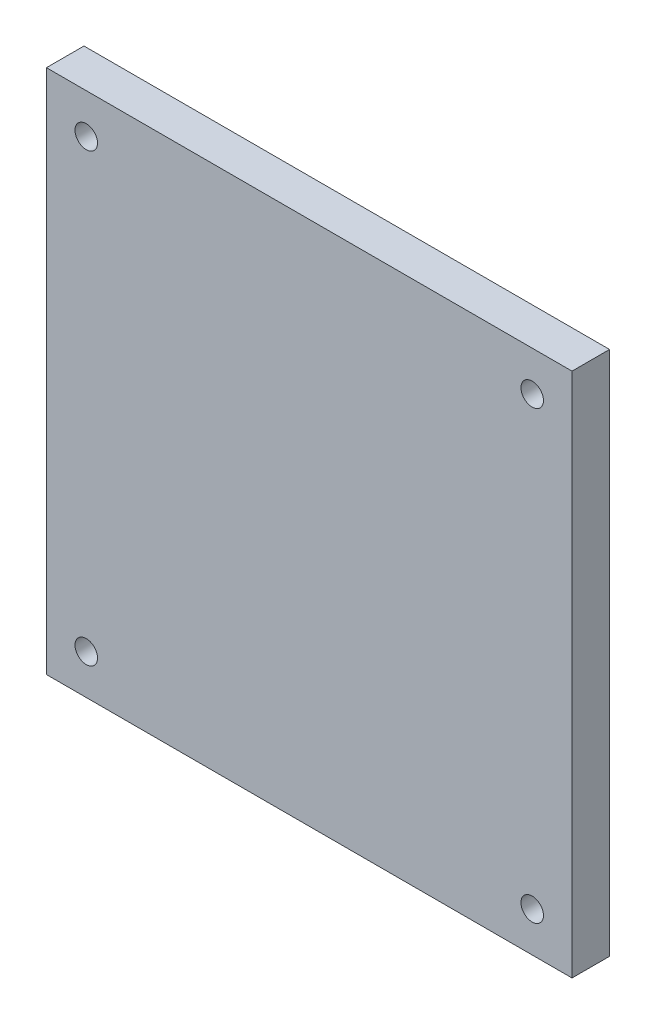
ISO-10303-21;
HEADER;
FILE_DESCRIPTION(('STEP AP214'),'2;1');
FILE_NAME('part.step','',(''),(''),'','','');
FILE_SCHEMA(('AUTOMOTIVE_DESIGN { 1 0 10303 214 1 1 1 1 }'));
ENDSEC;
DATA;
#1=APPLICATION_CONTEXT('core data for automotive mechanical design processes');
#2=APPLICATION_PROTOCOL_DEFINITION('international standard','automotive_design',2000,#1);
#3=PRODUCT_CONTEXT('',#1,'mechanical');
#4=PRODUCT('Part','Part','',(#3));
#5=PRODUCT_RELATED_PRODUCT_CATEGORY('part','',(#4));
#6=PRODUCT_DEFINITION_FORMATION('','',#4);
#7=PRODUCT_DEFINITION_CONTEXT('part definition',#1,'design');
#8=PRODUCT_DEFINITION('design','',#6,#7);
#9=PRODUCT_DEFINITION_SHAPE('','',#8);
#10=(LENGTH_UNIT() NAMED_UNIT(*) SI_UNIT(.MILLI.,.METRE.));
#11=(NAMED_UNIT(*) PLANE_ANGLE_UNIT() SI_UNIT($,.RADIAN.));
#12=(NAMED_UNIT(*) SI_UNIT($,.STERADIAN.) SOLID_ANGLE_UNIT());
#13=UNCERTAINTY_MEASURE_WITH_UNIT(LENGTH_MEASURE(1.E-05),#10,'distance_accuracy_value','');
#14=(GEOMETRIC_REPRESENTATION_CONTEXT(3) GLOBAL_UNCERTAINTY_ASSIGNED_CONTEXT((#13)) GLOBAL_UNIT_ASSIGNED_CONTEXT((#10,
#11,#12)) REPRESENTATION_CONTEXT('',''));
#15=CARTESIAN_POINT('',(0.,0.,0.));
#16=DIRECTION('',(0.,0.,1.));
#17=DIRECTION('',(1.,0.,0.));
#18=AXIS2_PLACEMENT_3D('',#15,#16,#17);
#19=CARTESIAN_POINT('',(-35.,-35.,5.));
#20=DIRECTION('',(1.,0.,0.));
#21=DIRECTION('',(0.,0.,-1.));
#22=AXIS2_PLACEMENT_3D('',#19,#20,#21);
#23=PLANE('',#22);
#24=DIRECTION('',(0.,-1.,0.));
#25=VECTOR('',#24,1.);
#26=CARTESIAN_POINT('',(-35.,-35.,0.));
#27=LINE('',#26,#25);
#28=CARTESIAN_POINT('',(-35.,35.,0.));
#29=VERTEX_POINT('',#28);
#30=CARTESIAN_POINT('',(-35.,-35.,0.));
#31=VERTEX_POINT('',#30);
#32=EDGE_CURVE('E111',#29,#31,#27,.T.);
#33=ORIENTED_EDGE('',*,*,#32,.T.);
#34=DIRECTION('',(0.,0.,-1.));
#35=VECTOR('',#34,1.);
#36=CARTESIAN_POINT('',(-35.,-35.,5.));
#37=LINE('',#36,#35);
#38=CARTESIAN_POINT('',(-35.,-35.,5.));
#39=VERTEX_POINT('',#38);
#40=EDGE_CURVE('E11',#39,#31,#37,.T.);
#41=ORIENTED_EDGE('',*,*,#40,.F.);
#42=DIRECTION('',(0.,-1.,0.));
#43=VECTOR('',#42,1.);
#44=CARTESIAN_POINT('',(-35.,-35.,5.));
#45=LINE('',#44,#43);
#46=CARTESIAN_POINT('',(-35.,35.,5.));
#47=VERTEX_POINT('',#46);
#48=EDGE_CURVE('E95',#47,#39,#45,.T.);
#49=ORIENTED_EDGE('',*,*,#48,.F.);
#50=DIRECTION('',(0.,0.,-1.));
#51=VECTOR('',#50,1.);
#52=CARTESIAN_POINT('',(-35.,35.,5.));
#53=LINE('',#52,#51);
#54=EDGE_CURVE('E107',#47,#29,#53,.T.);
#55=ORIENTED_EDGE('',*,*,#54,.T.);
#56=EDGE_LOOP('',(#33,#41,#49,#55));
#57=FACE_BOUND('',#56,.T.);
#58=ADVANCED_FACE('F43',(#57),#23,.F.);
#59=CARTESIAN_POINT('',(35.,-35.,5.));
#60=DIRECTION('',(0.,1.,0.));
#61=DIRECTION('',(-1.,0.,0.));
#62=AXIS2_PLACEMENT_3D('',#59,#60,#61);
#63=PLANE('',#62);
#64=DIRECTION('',(1.,0.,0.));
#65=VECTOR('',#64,1.);
#66=CARTESIAN_POINT('',(35.,-35.,0.));
#67=LINE('',#66,#65);
#68=CARTESIAN_POINT('',(35.,-35.,0.));
#69=VERTEX_POINT('',#68);
#70=EDGE_CURVE('E100',#31,#69,#67,.T.);
#71=ORIENTED_EDGE('',*,*,#70,.T.);
#72=DIRECTION('',(0.,0.,-1.));
#73=VECTOR('',#72,1.);
#74=CARTESIAN_POINT('',(35.,-35.,5.));
#75=LINE('',#74,#73);
#76=CARTESIAN_POINT('',(35.,-35.,5.));
#77=VERTEX_POINT('',#76);
#78=EDGE_CURVE('E52',#77,#69,#75,.T.);
#79=ORIENTED_EDGE('',*,*,#78,.F.);
#80=DIRECTION('',(1.,0.,0.));
#81=VECTOR('',#80,1.);
#82=CARTESIAN_POINT('',(35.,-35.,5.));
#83=LINE('',#82,#81);
#84=EDGE_CURVE('E90',#39,#77,#83,.T.);
#85=ORIENTED_EDGE('',*,*,#84,.F.);
#86=ORIENTED_EDGE('',*,*,#40,.T.);
#87=EDGE_LOOP('',(#71,#79,#85,#86));
#88=FACE_BOUND('',#87,.T.);
#89=ADVANCED_FACE('F99',(#88),#63,.F.);
#90=CARTESIAN_POINT('',(35.,-35.,5.));
#91=DIRECTION('',(-1.,0.,0.));
#92=DIRECTION('',(0.,0.,1.));
#93=AXIS2_PLACEMENT_3D('',#90,#91,#92);
#94=PLANE('',#93);
#95=DIRECTION('',(0.,1.,0.));
#96=VECTOR('',#95,1.);
#97=CARTESIAN_POINT('',(35.,-35.,0.));
#98=LINE('',#97,#96);
#99=CARTESIAN_POINT('',(35.,35.,0.));
#100=VERTEX_POINT('',#99);
#101=EDGE_CURVE('E77',#69,#100,#98,.T.);
#102=ORIENTED_EDGE('',*,*,#101,.T.);
#103=DIRECTION('',(0.,0.,-1.));
#104=VECTOR('',#103,1.);
#105=CARTESIAN_POINT('',(35.,35.,5.));
#106=LINE('',#105,#104);
#107=CARTESIAN_POINT('',(35.,35.,5.));
#108=VERTEX_POINT('',#107);
#109=EDGE_CURVE('E102',#108,#100,#106,.T.);
#110=ORIENTED_EDGE('',*,*,#109,.F.);
#111=DIRECTION('',(0.,1.,0.));
#112=VECTOR('',#111,1.);
#113=CARTESIAN_POINT('',(35.,-35.,5.));
#114=LINE('',#113,#112);
#115=EDGE_CURVE('E93',#77,#108,#114,.T.);
#116=ORIENTED_EDGE('',*,*,#115,.F.);
#117=ORIENTED_EDGE('',*,*,#78,.T.);
#118=EDGE_LOOP('',(#102,#110,#116,#117));
#119=FACE_BOUND('',#118,.T.);
#120=ADVANCED_FACE('F103',(#119),#94,.F.);
#121=CARTESIAN_POINT('',(35.,35.,5.));
#122=DIRECTION('',(0.,-1.,0.));
#123=DIRECTION('',(1.,0.,0.));
#124=AXIS2_PLACEMENT_3D('',#121,#122,#123);
#125=PLANE('',#124);
#126=DIRECTION('',(-1.,0.,0.));
#127=VECTOR('',#126,1.);
#128=CARTESIAN_POINT('',(35.,35.,0.));
#129=LINE('',#128,#127);
#130=EDGE_CURVE('E83',#100,#29,#129,.T.);
#131=ORIENTED_EDGE('',*,*,#130,.T.);
#132=ORIENTED_EDGE('',*,*,#54,.F.);
#133=DIRECTION('',(-1.,0.,0.));
#134=VECTOR('',#133,1.);
#135=CARTESIAN_POINT('',(35.,35.,5.));
#136=LINE('',#135,#134);
#137=EDGE_CURVE('E60',#108,#47,#136,.T.);
#138=ORIENTED_EDGE('',*,*,#137,.F.);
#139=ORIENTED_EDGE('',*,*,#109,.T.);
#140=EDGE_LOOP('',(#131,#132,#138,#139));
#141=FACE_BOUND('',#140,.T.);
#142=ADVANCED_FACE('F125',(#141),#125,.F.);
#143=CARTESIAN_POINT('',(0.,0.,5.));
#144=DIRECTION('',(0.,0.,1.));
#145=DIRECTION('',(1.,0.,0.));
#146=AXIS2_PLACEMENT_3D('',#143,#144,#145);
#147=PLANE('',#146);
#148=CARTESIAN_POINT('',(-29.6966991411012,-29.6966991411006,5.));
#149=DIRECTION('',(0.,0.,1.));
#150=DIRECTION('',(1.,0.,0.));
#151=AXIS2_PLACEMENT_3D('',#148,#149,#150);
#152=CIRCLE('',#151,1.5);
#153=CARTESIAN_POINT('',(-28.1966991411012,-29.6966991411006,5.));
#154=VERTEX_POINT('',#153);
#155=EDGE_CURVE('E144',#154,#154,#152,.T.);
#156=ORIENTED_EDGE('',*,*,#155,.F.);
#157=EDGE_LOOP('',(#156));
#158=FACE_BOUND('',#157,.T.);
#159=CARTESIAN_POINT('',(29.6966991411007,-29.6966991411011,5.));
#160=DIRECTION('',(0.,0.,1.));
#161=DIRECTION('',(1.,0.,0.));
#162=AXIS2_PLACEMENT_3D('',#159,#160,#161);
#163=CIRCLE('',#162,1.5);
#164=CARTESIAN_POINT('',(31.1966991411007,-29.6966991411011,5.));
#165=VERTEX_POINT('',#164);
#166=EDGE_CURVE('E152',#165,#165,#163,.T.);
#167=ORIENTED_EDGE('',*,*,#166,.F.);
#168=EDGE_LOOP('',(#167));
#169=FACE_BOUND('',#168,.T.);
#170=CARTESIAN_POINT('',(29.696699141101,29.6966991411008,5.));
#171=DIRECTION('',(0.,0.,1.));
#172=DIRECTION('',(1.,0.,0.));
#173=AXIS2_PLACEMENT_3D('',#170,#171,#172);
#174=CIRCLE('',#173,1.5);
#175=CARTESIAN_POINT('',(31.196699141101,29.6966991411008,5.));
#176=VERTEX_POINT('',#175);
#177=EDGE_CURVE('E136',#176,#176,#174,.T.);
#178=ORIENTED_EDGE('',*,*,#177,.F.);
#179=EDGE_LOOP('',(#178));
#180=FACE_BOUND('',#179,.T.);
#181=CARTESIAN_POINT('',(-29.6966991411009,29.6966991411009,5.));
#182=DIRECTION('',(0.,0.,1.));
#183=DIRECTION('',(1.,0.,0.));
#184=AXIS2_PLACEMENT_3D('',#181,#182,#183);
#185=CIRCLE('',#184,1.5);
#186=CARTESIAN_POINT('',(-28.1966991411009,29.6966991411009,5.));
#187=VERTEX_POINT('',#186);
#188=EDGE_CURVE('E132',#187,#187,#185,.T.);
#189=ORIENTED_EDGE('',*,*,#188,.F.);
#190=EDGE_LOOP('',(#189));
#191=FACE_BOUND('',#190,.T.);
#192=ORIENTED_EDGE('',*,*,#48,.T.);
#193=ORIENTED_EDGE('',*,*,#84,.T.);
#194=ORIENTED_EDGE('',*,*,#115,.T.);
#195=ORIENTED_EDGE('',*,*,#137,.T.);
#196=EDGE_LOOP('',(#192,#193,#194,#195));
#197=FACE_BOUND('',#196,.T.);
#198=ADVANCED_FACE('F91',(#158,#169,#180,#191,#197),#147,.T.);
#199=CARTESIAN_POINT('',(0.,0.,0.));
#200=DIRECTION('',(0.,0.,1.));
#201=DIRECTION('',(1.,0.,0.));
#202=AXIS2_PLACEMENT_3D('',#199,#200,#201);
#203=PLANE('',#202);
#204=CARTESIAN_POINT('',(-29.6966991411012,-29.6966991411006,0.));
#205=DIRECTION('',(0.,0.,1.));
#206=DIRECTION('',(1.,0.,0.));
#207=AXIS2_PLACEMENT_3D('',#204,#205,#206);
#208=CIRCLE('',#207,1.5);
#209=CARTESIAN_POINT('',(-28.1966991411012,-29.6966991411006,0.));
#210=VERTEX_POINT('',#209);
#211=EDGE_CURVE('E140',#210,#210,#208,.T.);
#212=ORIENTED_EDGE('',*,*,#211,.T.);
#213=EDGE_LOOP('',(#212));
#214=FACE_BOUND('',#213,.T.);
#215=CARTESIAN_POINT('',(29.6966991411007,-29.6966991411011,0.));
#216=DIRECTION('',(0.,0.,1.));
#217=DIRECTION('',(1.,0.,0.));
#218=AXIS2_PLACEMENT_3D('',#215,#216,#217);
#219=CIRCLE('',#218,1.5);
#220=CARTESIAN_POINT('',(31.1966991411007,-29.6966991411011,0.));
#221=VERTEX_POINT('',#220);
#222=EDGE_CURVE('E148',#221,#221,#219,.T.);
#223=ORIENTED_EDGE('',*,*,#222,.T.);
#224=EDGE_LOOP('',(#223));
#225=FACE_BOUND('',#224,.T.);
#226=CARTESIAN_POINT('',(29.696699141101,29.6966991411008,0.));
#227=DIRECTION('',(0.,0.,1.));
#228=DIRECTION('',(1.,0.,0.));
#229=AXIS2_PLACEMENT_3D('',#226,#227,#228);
#230=CIRCLE('',#229,1.5);
#231=CARTESIAN_POINT('',(31.196699141101,29.6966991411008,0.));
#232=VERTEX_POINT('',#231);
#233=EDGE_CURVE('E156',#232,#232,#230,.T.);
#234=ORIENTED_EDGE('',*,*,#233,.T.);
#235=EDGE_LOOP('',(#234));
#236=FACE_BOUND('',#235,.T.);
#237=CARTESIAN_POINT('',(-29.6966991411009,29.6966991411009,0.));
#238=DIRECTION('',(0.,0.,1.));
#239=DIRECTION('',(1.,0.,0.));
#240=AXIS2_PLACEMENT_3D('',#237,#238,#239);
#241=CIRCLE('',#240,1.5);
#242=CARTESIAN_POINT('',(-28.1966991411009,29.6966991411009,0.));
#243=VERTEX_POINT('',#242);
#244=EDGE_CURVE('E115',#243,#243,#241,.T.);
#245=ORIENTED_EDGE('',*,*,#244,.T.);
#246=EDGE_LOOP('',(#245));
#247=FACE_BOUND('',#246,.T.);
#248=ORIENTED_EDGE('',*,*,#32,.F.);
#249=ORIENTED_EDGE('',*,*,#130,.F.);
#250=ORIENTED_EDGE('',*,*,#101,.F.);
#251=ORIENTED_EDGE('',*,*,#70,.F.);
#252=EDGE_LOOP('',(#248,#249,#250,#251));
#253=FACE_BOUND('',#252,.T.);
#254=ADVANCED_FACE('F128',(#214,#225,#236,#247,#253),#203,.F.);
#255=CARTESIAN_POINT('',(-29.6966991411009,29.6966991411009,0.));
#256=DIRECTION('',(0.,0.,1.));
#257=DIRECTION('',(1.,0.,0.));
#258=AXIS2_PLACEMENT_3D('',#255,#256,#257);
#259=CYLINDRICAL_SURFACE('',#258,1.5);
#260=ORIENTED_EDGE('',*,*,#244,.F.);
#261=EDGE_LOOP('',(#260));
#262=FACE_BOUND('',#261,.T.);
#263=ORIENTED_EDGE('',*,*,#188,.T.);
#264=EDGE_LOOP('',(#263));
#265=FACE_BOUND('',#264,.T.);
#266=ADVANCED_FACE('F172',(#262,#265),#259,.F.);
#267=CARTESIAN_POINT('',(29.696699141101,29.6966991411008,0.));
#268=DIRECTION('',(0.,0.,1.));
#269=DIRECTION('',(1.,0.,0.));
#270=AXIS2_PLACEMENT_3D('',#267,#268,#269);
#271=CYLINDRICAL_SURFACE('',#270,1.5);
#272=ORIENTED_EDGE('',*,*,#233,.F.);
#273=EDGE_LOOP('',(#272));
#274=FACE_BOUND('',#273,.T.);
#275=ORIENTED_EDGE('',*,*,#177,.T.);
#276=EDGE_LOOP('',(#275));
#277=FACE_BOUND('',#276,.T.);
#278=ADVANCED_FACE('F164',(#274,#277),#271,.F.);
#279=CARTESIAN_POINT('',(29.6966991411007,-29.6966991411011,0.));
#280=DIRECTION('',(0.,0.,1.));
#281=DIRECTION('',(1.,0.,0.));
#282=AXIS2_PLACEMENT_3D('',#279,#280,#281);
#283=CYLINDRICAL_SURFACE('',#282,1.5);
#284=ORIENTED_EDGE('',*,*,#222,.F.);
#285=EDGE_LOOP('',(#284));
#286=FACE_BOUND('',#285,.T.);
#287=ORIENTED_EDGE('',*,*,#166,.T.);
#288=EDGE_LOOP('',(#287));
#289=FACE_BOUND('',#288,.T.);
#290=ADVANCED_FACE('F180',(#286,#289),#283,.F.);
#291=CARTESIAN_POINT('',(-29.6966991411012,-29.6966991411006,0.));
#292=DIRECTION('',(0.,0.,1.));
#293=DIRECTION('',(1.,0.,0.));
#294=AXIS2_PLACEMENT_3D('',#291,#292,#293);
#295=CYLINDRICAL_SURFACE('',#294,1.5);
#296=ORIENTED_EDGE('',*,*,#211,.F.);
#297=EDGE_LOOP('',(#296));
#298=FACE_BOUND('',#297,.T.);
#299=ORIENTED_EDGE('',*,*,#155,.T.);
#300=EDGE_LOOP('',(#299));
#301=FACE_BOUND('',#300,.T.);
#302=ADVANCED_FACE('F231',(#298,#301),#295,.F.);
#303=CLOSED_SHELL('',(#58,#89,#120,#142,#198,#254,#266,#278,#290,#302));
#304=MANIFOLD_SOLID_BREP('B2',#303);
#305=ADVANCED_BREP_SHAPE_REPRESENTATION('',(#18,#304),#14);
#306=SHAPE_DEFINITION_REPRESENTATION(#9,#305);
ENDSEC;
END-ISO-10303-21;
